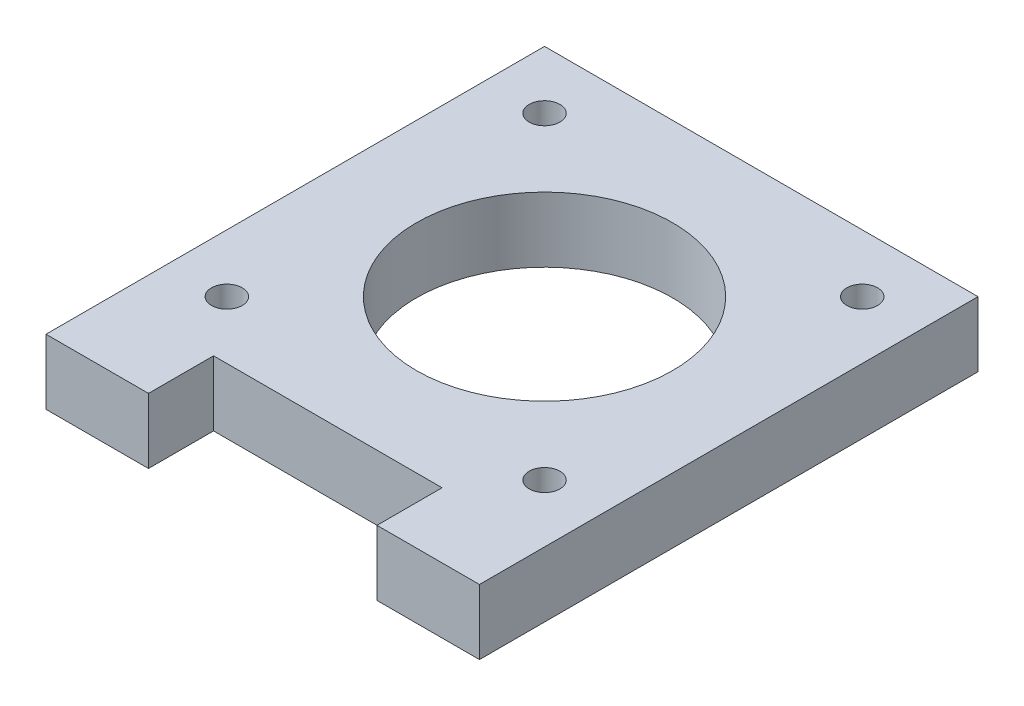
ISO-10303-21;
HEADER;
FILE_DESCRIPTION(('STEP AP214'),'2;1');
FILE_NAME('part.step','',(''),(''),'','','');
FILE_SCHEMA(('AUTOMOTIVE_DESIGN { 1 0 10303 214 1 1 1 1 }'));
ENDSEC;
DATA;
#1=APPLICATION_CONTEXT('core data for automotive mechanical design processes');
#2=APPLICATION_PROTOCOL_DEFINITION('international standard','automotive_design',2000,#1);
#3=PRODUCT_CONTEXT('',#1,'mechanical');
#4=PRODUCT('Part','Part','',(#3));
#5=PRODUCT_RELATED_PRODUCT_CATEGORY('part','',(#4));
#6=PRODUCT_DEFINITION_FORMATION('','',#4);
#7=PRODUCT_DEFINITION_CONTEXT('part definition',#1,'design');
#8=PRODUCT_DEFINITION('design','',#6,#7);
#9=PRODUCT_DEFINITION_SHAPE('','',#8);
#10=(LENGTH_UNIT() NAMED_UNIT(*) SI_UNIT(.MILLI.,.METRE.));
#11=(NAMED_UNIT(*) PLANE_ANGLE_UNIT() SI_UNIT($,.RADIAN.));
#12=(NAMED_UNIT(*) SI_UNIT($,.STERADIAN.) SOLID_ANGLE_UNIT());
#13=UNCERTAINTY_MEASURE_WITH_UNIT(LENGTH_MEASURE(1.E-05),#10,'distance_accuracy_value','');
#14=(GEOMETRIC_REPRESENTATION_CONTEXT(3) GLOBAL_UNCERTAINTY_ASSIGNED_CONTEXT((#13)) GLOBAL_UNIT_ASSIGNED_CONTEXT((#10,
#11,#12)) REPRESENTATION_CONTEXT('',''));
#15=CARTESIAN_POINT('',(0.,0.,0.));
#16=DIRECTION('',(0.,0.,1.));
#17=DIRECTION('',(1.,0.,0.));
#18=AXIS2_PLACEMENT_3D('',#15,#16,#17);
#19=CARTESIAN_POINT('',(0.,3.175,0.));
#20=DIRECTION('',(0.,-1.,0.));
#21=DIRECTION('',(0.,0.,-1.));
#22=AXIS2_PLACEMENT_3D('',#19,#20,#21);
#23=PLANE('',#22);
#24=DIRECTION('',(0.,0.,-1.));
#25=VECTOR('',#24,1.);
#26=CARTESIAN_POINT('',(21.15,3.175,21.15));
#27=LINE('',#26,#25);
#28=CARTESIAN_POINT('',(21.15,3.175,27.5));
#29=VERTEX_POINT('',#28);
#30=CARTESIAN_POINT('',(21.15,3.175,-21.15));
#31=VERTEX_POINT('',#30);
#32=EDGE_CURVE('E57',#29,#31,#27,.T.);
#33=ORIENTED_EDGE('',*,*,#32,.T.);
#34=DIRECTION('',(-1.,0.,0.));
#35=VECTOR('',#34,1.);
#36=CARTESIAN_POINT('',(-21.15,3.175,-21.15));
#37=LINE('',#36,#35);
#38=CARTESIAN_POINT('',(-21.15,3.175,-21.15));
#39=VERTEX_POINT('',#38);
#40=EDGE_CURVE('E101',#31,#39,#37,.T.);
#41=ORIENTED_EDGE('',*,*,#40,.T.);
#42=DIRECTION('',(0.,0.,1.));
#43=VECTOR('',#42,1.);
#44=CARTESIAN_POINT('',(-21.15,3.175,21.15));
#45=LINE('',#44,#43);
#46=CARTESIAN_POINT('',(-21.15,3.175,27.5));
#47=VERTEX_POINT('',#46);
#48=EDGE_CURVE('E187',#39,#47,#45,.T.);
#49=ORIENTED_EDGE('',*,*,#48,.T.);
#50=DIRECTION('',(1.,0.,0.));
#51=VECTOR('',#50,1.);
#52=CARTESIAN_POINT('',(-21.15,3.175,27.5));
#53=LINE('',#52,#51);
#54=CARTESIAN_POINT('',(-11.15,3.175,27.5));
#55=VERTEX_POINT('',#54);
#56=EDGE_CURVE('E202',#47,#55,#53,.T.);
#57=ORIENTED_EDGE('',*,*,#56,.T.);
#58=DIRECTION('',(0.,0.,-1.));
#59=VECTOR('',#58,1.);
#60=CARTESIAN_POINT('',(-11.15,3.175,27.5));
#61=LINE('',#60,#59);
#62=CARTESIAN_POINT('',(-11.15,3.175,21.15));
#63=VERTEX_POINT('',#62);
#64=EDGE_CURVE('E121',#55,#63,#61,.T.);
#65=ORIENTED_EDGE('',*,*,#64,.T.);
#66=DIRECTION('',(1.,0.,0.));
#67=VECTOR('',#66,1.);
#68=CARTESIAN_POINT('',(-11.15,3.175,21.15));
#69=LINE('',#68,#67);
#70=CARTESIAN_POINT('',(11.15,3.175,21.15));
#71=VERTEX_POINT('',#70);
#72=EDGE_CURVE('E115',#63,#71,#69,.T.);
#73=ORIENTED_EDGE('',*,*,#72,.T.);
#74=DIRECTION('',(0.,0.,1.));
#75=VECTOR('',#74,1.);
#76=CARTESIAN_POINT('',(11.15,3.175,21.15));
#77=LINE('',#76,#75);
#78=CARTESIAN_POINT('',(11.15,3.175,27.5));
#79=VERTEX_POINT('',#78);
#80=EDGE_CURVE('E119',#71,#79,#77,.T.);
#81=ORIENTED_EDGE('',*,*,#80,.T.);
#82=DIRECTION('',(1.,0.,0.));
#83=VECTOR('',#82,1.);
#84=CARTESIAN_POINT('',(11.15,3.175,27.5));
#85=LINE('',#84,#83);
#86=EDGE_CURVE('E138',#79,#29,#85,.T.);
#87=ORIENTED_EDGE('',*,*,#86,.T.);
#88=EDGE_LOOP('',(#33,#41,#49,#57,#65,#73,#81,#87));
#89=FACE_BOUND('',#88,.T.);
#90=CARTESIAN_POINT('',(0.,3.175,0.));
#91=DIRECTION('',(0.,1.,0.));
#92=DIRECTION('',(0.,0.,1.));
#93=AXIS2_PLACEMENT_3D('',#90,#91,#92);
#94=CIRCLE('',#93,12.5);
#95=CARTESIAN_POINT('',(0.,3.175,12.5));
#96=VERTEX_POINT('',#95);
#97=EDGE_CURVE('E150',#96,#96,#94,.T.);
#98=ORIENTED_EDGE('',*,*,#97,.F.);
#99=EDGE_LOOP('',(#98));
#100=FACE_BOUND('',#99,.T.);
#101=CARTESIAN_POINT('',(-15.5,3.175,-15.5));
#102=DIRECTION('',(0.,1.,0.));
#103=DIRECTION('',(0.,0.,1.));
#104=AXIS2_PLACEMENT_3D('',#101,#102,#103);
#105=CIRCLE('',#104,1.5);
#106=CARTESIAN_POINT('',(-15.5,3.175,-14.));
#107=VERTEX_POINT('',#106);
#108=EDGE_CURVE('E216',#107,#107,#105,.T.);
#109=ORIENTED_EDGE('',*,*,#108,.F.);
#110=EDGE_LOOP('',(#109));
#111=FACE_BOUND('',#110,.T.);
#112=CARTESIAN_POINT('',(15.5,3.175,-15.5));
#113=DIRECTION('',(0.,1.,0.));
#114=DIRECTION('',(0.,0.,1.));
#115=AXIS2_PLACEMENT_3D('',#112,#113,#114);
#116=CIRCLE('',#115,1.5);
#117=CARTESIAN_POINT('',(15.5,3.175,-14.));
#118=VERTEX_POINT('',#117);
#119=EDGE_CURVE('E224',#118,#118,#116,.T.);
#120=ORIENTED_EDGE('',*,*,#119,.F.);
#121=EDGE_LOOP('',(#120));
#122=FACE_BOUND('',#121,.T.);
#123=CARTESIAN_POINT('',(15.5,3.175,15.5));
#124=DIRECTION('',(0.,1.,0.));
#125=DIRECTION('',(0.,0.,1.));
#126=AXIS2_PLACEMENT_3D('',#123,#124,#125);
#127=CIRCLE('',#126,1.5);
#128=CARTESIAN_POINT('',(15.5,3.175,17.));
#129=VERTEX_POINT('',#128);
#130=EDGE_CURVE('E232',#129,#129,#127,.T.);
#131=ORIENTED_EDGE('',*,*,#130,.F.);
#132=EDGE_LOOP('',(#131));
#133=FACE_BOUND('',#132,.T.);
#134=CARTESIAN_POINT('',(-15.5,3.175,15.5));
#135=DIRECTION('',(0.,1.,0.));
#136=DIRECTION('',(0.,0.,1.));
#137=AXIS2_PLACEMENT_3D('',#134,#135,#136);
#138=CIRCLE('',#137,1.5);
#139=CARTESIAN_POINT('',(-15.5,3.175,17.));
#140=VERTEX_POINT('',#139);
#141=EDGE_CURVE('E240',#140,#140,#138,.T.);
#142=ORIENTED_EDGE('',*,*,#141,.F.);
#143=EDGE_LOOP('',(#142));
#144=FACE_BOUND('',#143,.T.);
#145=ADVANCED_FACE('F39',(#89,#100,#111,#122,#133,#144),#23,.F.);
#146=CARTESIAN_POINT('',(0.,-3.175,0.));
#147=DIRECTION('',(0.,-1.,0.));
#148=DIRECTION('',(0.,0.,-1.));
#149=AXIS2_PLACEMENT_3D('',#146,#147,#148);
#150=PLANE('',#149);
#151=CARTESIAN_POINT('',(15.5,-3.175,15.5));
#152=DIRECTION('',(0.,1.,0.));
#153=DIRECTION('',(0.,0.,1.));
#154=AXIS2_PLACEMENT_3D('',#151,#152,#153);
#155=CIRCLE('',#154,1.5);
#156=CARTESIAN_POINT('',(15.5,-3.175,17.));
#157=VERTEX_POINT('',#156);
#158=EDGE_CURVE('E236',#157,#157,#155,.T.);
#159=ORIENTED_EDGE('',*,*,#158,.T.);
#160=EDGE_LOOP('',(#159));
#161=FACE_BOUND('',#160,.T.);
#162=CARTESIAN_POINT('',(-15.5,-3.175,-15.5));
#163=DIRECTION('',(0.,1.,0.));
#164=DIRECTION('',(0.,0.,1.));
#165=AXIS2_PLACEMENT_3D('',#162,#163,#164);
#166=CIRCLE('',#165,1.5);
#167=CARTESIAN_POINT('',(-15.5,-3.175,-14.));
#168=VERTEX_POINT('',#167);
#169=EDGE_CURVE('E220',#168,#168,#166,.T.);
#170=ORIENTED_EDGE('',*,*,#169,.T.);
#171=EDGE_LOOP('',(#170));
#172=FACE_BOUND('',#171,.T.);
#173=DIRECTION('',(-1.,0.,0.));
#174=VECTOR('',#173,1.);
#175=CARTESIAN_POINT('',(-21.15,-3.175,-21.15));
#176=LINE('',#175,#174);
#177=CARTESIAN_POINT('',(21.15,-3.175,-21.15));
#178=VERTEX_POINT('',#177);
#179=CARTESIAN_POINT('',(-21.15,-3.175,-21.15));
#180=VERTEX_POINT('',#179);
#181=EDGE_CURVE('E145',#178,#180,#176,.T.);
#182=ORIENTED_EDGE('',*,*,#181,.F.);
#183=DIRECTION('',(0.,0.,-1.));
#184=VECTOR('',#183,1.);
#185=CARTESIAN_POINT('',(21.15,-3.175,27.5));
#186=LINE('',#185,#184);
#187=CARTESIAN_POINT('',(21.15,-3.175,27.5));
#188=VERTEX_POINT('',#187);
#189=EDGE_CURVE('E165',#188,#178,#186,.T.);
#190=ORIENTED_EDGE('',*,*,#189,.F.);
#191=DIRECTION('',(1.,0.,0.));
#192=VECTOR('',#191,1.);
#193=CARTESIAN_POINT('',(11.15,-3.175,27.5));
#194=LINE('',#193,#192);
#195=CARTESIAN_POINT('',(11.15,-3.175,27.5));
#196=VERTEX_POINT('',#195);
#197=EDGE_CURVE('E94',#196,#188,#194,.T.);
#198=ORIENTED_EDGE('',*,*,#197,.F.);
#199=DIRECTION('',(0.,0.,1.));
#200=VECTOR('',#199,1.);
#201=CARTESIAN_POINT('',(11.15,-3.175,21.15));
#202=LINE('',#201,#200);
#203=CARTESIAN_POINT('',(11.15,-3.175,21.15));
#204=VERTEX_POINT('',#203);
#205=EDGE_CURVE('E87',#204,#196,#202,.T.);
#206=ORIENTED_EDGE('',*,*,#205,.F.);
#207=DIRECTION('',(1.,0.,0.));
#208=VECTOR('',#207,1.);
#209=CARTESIAN_POINT('',(-11.15,-3.175,21.15));
#210=LINE('',#209,#208);
#211=CARTESIAN_POINT('',(-11.15,-3.175,21.15));
#212=VERTEX_POINT('',#211);
#213=EDGE_CURVE('E130',#212,#204,#210,.T.);
#214=ORIENTED_EDGE('',*,*,#213,.F.);
#215=DIRECTION('',(0.,0.,-1.));
#216=VECTOR('',#215,1.);
#217=CARTESIAN_POINT('',(-11.15,-3.175,27.5));
#218=LINE('',#217,#216);
#219=CARTESIAN_POINT('',(-11.15,-3.175,27.5));
#220=VERTEX_POINT('',#219);
#221=EDGE_CURVE('E156',#220,#212,#218,.T.);
#222=ORIENTED_EDGE('',*,*,#221,.F.);
#223=DIRECTION('',(1.,0.,0.));
#224=VECTOR('',#223,1.);
#225=CARTESIAN_POINT('',(-21.15,-3.175,27.5));
#226=LINE('',#225,#224);
#227=CARTESIAN_POINT('',(-21.15,-3.175,27.5));
#228=VERTEX_POINT('',#227);
#229=EDGE_CURVE('E153',#228,#220,#226,.T.);
#230=ORIENTED_EDGE('',*,*,#229,.F.);
#231=DIRECTION('',(0.,0.,1.));
#232=VECTOR('',#231,1.);
#233=CARTESIAN_POINT('',(-21.15,-3.175,21.15));
#234=LINE('',#233,#232);
#235=EDGE_CURVE('E149',#180,#228,#234,.T.);
#236=ORIENTED_EDGE('',*,*,#235,.F.);
#237=EDGE_LOOP('',(#182,#190,#198,#206,#214,#222,#230,#236));
#238=FACE_BOUND('',#237,.T.);
#239=CARTESIAN_POINT('',(0.,-3.175,0.));
#240=DIRECTION('',(0.,1.,0.));
#241=DIRECTION('',(0.,0.,1.));
#242=AXIS2_PLACEMENT_3D('',#239,#240,#241);
#243=CIRCLE('',#242,12.5);
#244=CARTESIAN_POINT('',(0.,-3.175,12.5));
#245=VERTEX_POINT('',#244);
#246=EDGE_CURVE('E212',#245,#245,#243,.T.);
#247=ORIENTED_EDGE('',*,*,#246,.T.);
#248=EDGE_LOOP('',(#247));
#249=FACE_BOUND('',#248,.T.);
#250=CARTESIAN_POINT('',(15.5,-3.175,-15.5));
#251=DIRECTION('',(0.,1.,0.));
#252=DIRECTION('',(0.,0.,1.));
#253=AXIS2_PLACEMENT_3D('',#250,#251,#252);
#254=CIRCLE('',#253,1.5);
#255=CARTESIAN_POINT('',(15.5,-3.175,-14.));
#256=VERTEX_POINT('',#255);
#257=EDGE_CURVE('E228',#256,#256,#254,.T.);
#258=ORIENTED_EDGE('',*,*,#257,.T.);
#259=EDGE_LOOP('',(#258));
#260=FACE_BOUND('',#259,.T.);
#261=CARTESIAN_POINT('',(-15.5,-3.175,15.5));
#262=DIRECTION('',(0.,1.,0.));
#263=DIRECTION('',(0.,0.,1.));
#264=AXIS2_PLACEMENT_3D('',#261,#262,#263);
#265=CIRCLE('',#264,1.5);
#266=CARTESIAN_POINT('',(-15.5,-3.175,17.));
#267=VERTEX_POINT('',#266);
#268=EDGE_CURVE('E244',#267,#267,#265,.T.);
#269=ORIENTED_EDGE('',*,*,#268,.T.);
#270=EDGE_LOOP('',(#269));
#271=FACE_BOUND('',#270,.T.);
#272=ADVANCED_FACE('F191',(#161,#172,#238,#249,#260,#271),#150,.T.);
#273=CARTESIAN_POINT('',(-21.15,3.175,-21.15));
#274=DIRECTION('',(0.,0.,1.));
#275=DIRECTION('',(1.,0.,0.));
#276=AXIS2_PLACEMENT_3D('',#273,#274,#275);
#277=PLANE('',#276);
#278=ORIENTED_EDGE('',*,*,#181,.T.);
#279=DIRECTION('',(0.,-1.,0.));
#280=VECTOR('',#279,1.);
#281=CARTESIAN_POINT('',(-21.15,3.175,-21.15));
#282=LINE('',#281,#280);
#283=EDGE_CURVE('E49',#39,#180,#282,.T.);
#284=ORIENTED_EDGE('',*,*,#283,.F.);
#285=ORIENTED_EDGE('',*,*,#40,.F.);
#286=DIRECTION('',(0.,-1.,0.));
#287=VECTOR('',#286,1.);
#288=CARTESIAN_POINT('',(21.15,3.175,-21.15));
#289=LINE('',#288,#287);
#290=EDGE_CURVE('E11',#31,#178,#289,.T.);
#291=ORIENTED_EDGE('',*,*,#290,.T.);
#292=EDGE_LOOP('',(#278,#284,#285,#291));
#293=FACE_BOUND('',#292,.T.);
#294=ADVANCED_FACE('F41',(#293),#277,.F.);
#295=CARTESIAN_POINT('',(-21.15,3.175,21.15));
#296=DIRECTION('',(1.,0.,0.));
#297=DIRECTION('',(0.,0.,-1.));
#298=AXIS2_PLACEMENT_3D('',#295,#296,#297);
#299=PLANE('',#298);
#300=ORIENTED_EDGE('',*,*,#235,.T.);
#301=DIRECTION('',(0.,-1.,0.));
#302=VECTOR('',#301,1.);
#303=CARTESIAN_POINT('',(-21.15,3.175,27.5));
#304=LINE('',#303,#302);
#305=EDGE_CURVE('E178',#47,#228,#304,.T.);
#306=ORIENTED_EDGE('',*,*,#305,.F.);
#307=ORIENTED_EDGE('',*,*,#48,.F.);
#308=ORIENTED_EDGE('',*,*,#283,.T.);
#309=EDGE_LOOP('',(#300,#306,#307,#308));
#310=FACE_BOUND('',#309,.T.);
#311=ADVANCED_FACE('F185',(#310),#299,.F.);
#312=CARTESIAN_POINT('',(-21.15,3.175,27.5));
#313=DIRECTION('',(0.,0.,-1.));
#314=DIRECTION('',(-1.,0.,0.));
#315=AXIS2_PLACEMENT_3D('',#312,#313,#314);
#316=PLANE('',#315);
#317=ORIENTED_EDGE('',*,*,#229,.T.);
#318=DIRECTION('',(0.,-1.,0.));
#319=VECTOR('',#318,1.);
#320=CARTESIAN_POINT('',(-11.15,3.175,27.5));
#321=LINE('',#320,#319);
#322=EDGE_CURVE('E174',#55,#220,#321,.T.);
#323=ORIENTED_EDGE('',*,*,#322,.F.);
#324=ORIENTED_EDGE('',*,*,#56,.F.);
#325=ORIENTED_EDGE('',*,*,#305,.T.);
#326=EDGE_LOOP('',(#317,#323,#324,#325));
#327=FACE_BOUND('',#326,.T.);
#328=ADVANCED_FACE('F197',(#327),#316,.F.);
#329=CARTESIAN_POINT('',(-11.15,3.175,27.5));
#330=DIRECTION('',(-1.,0.,0.));
#331=DIRECTION('',(0.,0.,1.));
#332=AXIS2_PLACEMENT_3D('',#329,#330,#331);
#333=PLANE('',#332);
#334=ORIENTED_EDGE('',*,*,#221,.T.);
#335=DIRECTION('',(0.,-1.,0.));
#336=VECTOR('',#335,1.);
#337=CARTESIAN_POINT('',(-11.15,3.175,21.15));
#338=LINE('',#337,#336);
#339=EDGE_CURVE('E132',#63,#212,#338,.T.);
#340=ORIENTED_EDGE('',*,*,#339,.F.);
#341=ORIENTED_EDGE('',*,*,#64,.F.);
#342=ORIENTED_EDGE('',*,*,#322,.T.);
#343=EDGE_LOOP('',(#334,#340,#341,#342));
#344=FACE_BOUND('',#343,.T.);
#345=ADVANCED_FACE('F200',(#344),#333,.F.);
#346=CARTESIAN_POINT('',(-11.15,3.175,21.15));
#347=DIRECTION('',(0.,0.,-1.));
#348=DIRECTION('',(-1.,0.,0.));
#349=AXIS2_PLACEMENT_3D('',#346,#347,#348);
#350=PLANE('',#349);
#351=ORIENTED_EDGE('',*,*,#213,.T.);
#352=DIRECTION('',(0.,-1.,0.));
#353=VECTOR('',#352,1.);
#354=CARTESIAN_POINT('',(11.15,3.175,21.15));
#355=LINE('',#354,#353);
#356=EDGE_CURVE('E127',#71,#204,#355,.T.);
#357=ORIENTED_EDGE('',*,*,#356,.F.);
#358=ORIENTED_EDGE('',*,*,#72,.F.);
#359=ORIENTED_EDGE('',*,*,#339,.T.);
#360=EDGE_LOOP('',(#351,#357,#358,#359));
#361=FACE_BOUND('',#360,.T.);
#362=ADVANCED_FACE('F128',(#361),#350,.F.);
#363=CARTESIAN_POINT('',(11.15,3.175,21.15));
#364=DIRECTION('',(1.,0.,0.));
#365=DIRECTION('',(0.,0.,-1.));
#366=AXIS2_PLACEMENT_3D('',#363,#364,#365);
#367=PLANE('',#366);
#368=ORIENTED_EDGE('',*,*,#205,.T.);
#369=DIRECTION('',(0.,-1.,0.));
#370=VECTOR('',#369,1.);
#371=CARTESIAN_POINT('',(11.15,3.175,27.5));
#372=LINE('',#371,#370);
#373=EDGE_CURVE('E133',#79,#196,#372,.T.);
#374=ORIENTED_EDGE('',*,*,#373,.F.);
#375=ORIENTED_EDGE('',*,*,#80,.F.);
#376=ORIENTED_EDGE('',*,*,#356,.T.);
#377=EDGE_LOOP('',(#368,#374,#375,#376));
#378=FACE_BOUND('',#377,.T.);
#379=ADVANCED_FACE('F135',(#378),#367,.F.);
#380=CARTESIAN_POINT('',(11.15,3.175,27.5));
#381=DIRECTION('',(0.,0.,-1.));
#382=DIRECTION('',(-1.,0.,0.));
#383=AXIS2_PLACEMENT_3D('',#380,#381,#382);
#384=PLANE('',#383);
#385=ORIENTED_EDGE('',*,*,#197,.T.);
#386=DIRECTION('',(0.,-1.,0.));
#387=VECTOR('',#386,1.);
#388=CARTESIAN_POINT('',(21.15,3.175,27.5));
#389=LINE('',#388,#387);
#390=EDGE_CURVE('E141',#29,#188,#389,.T.);
#391=ORIENTED_EDGE('',*,*,#390,.F.);
#392=ORIENTED_EDGE('',*,*,#86,.F.);
#393=ORIENTED_EDGE('',*,*,#373,.T.);
#394=EDGE_LOOP('',(#385,#391,#392,#393));
#395=FACE_BOUND('',#394,.T.);
#396=ADVANCED_FACE('F269',(#395),#384,.F.);
#397=CARTESIAN_POINT('',(21.15,3.175,27.5));
#398=DIRECTION('',(-1.,0.,0.));
#399=DIRECTION('',(0.,0.,1.));
#400=AXIS2_PLACEMENT_3D('',#397,#398,#399);
#401=PLANE('',#400);
#402=ORIENTED_EDGE('',*,*,#189,.T.);
#403=ORIENTED_EDGE('',*,*,#290,.F.);
#404=ORIENTED_EDGE('',*,*,#32,.F.);
#405=ORIENTED_EDGE('',*,*,#390,.T.);
#406=EDGE_LOOP('',(#402,#403,#404,#405));
#407=FACE_BOUND('',#406,.T.);
#408=ADVANCED_FACE('F266',(#407),#401,.F.);
#409=CARTESIAN_POINT('',(0.,3.175,0.));
#410=DIRECTION('',(0.,-1.,0.));
#411=DIRECTION('',(0.,0.,-1.));
#412=AXIS2_PLACEMENT_3D('',#409,#410,#411);
#413=CYLINDRICAL_SURFACE('',#412,12.5);
#414=ORIENTED_EDGE('',*,*,#97,.T.);
#415=EDGE_LOOP('',(#414));
#416=FACE_BOUND('',#415,.T.);
#417=ORIENTED_EDGE('',*,*,#246,.F.);
#418=EDGE_LOOP('',(#417));
#419=FACE_BOUND('',#418,.T.);
#420=ADVANCED_FACE('F263',(#416,#419),#413,.F.);
#421=CARTESIAN_POINT('',(-15.5,3.175,-15.5));
#422=DIRECTION('',(0.,-1.,0.));
#423=DIRECTION('',(0.,0.,-1.));
#424=AXIS2_PLACEMENT_3D('',#421,#422,#423);
#425=CYLINDRICAL_SURFACE('',#424,1.5);
#426=ORIENTED_EDGE('',*,*,#108,.T.);
#427=EDGE_LOOP('',(#426));
#428=FACE_BOUND('',#427,.T.);
#429=ORIENTED_EDGE('',*,*,#169,.F.);
#430=EDGE_LOOP('',(#429));
#431=FACE_BOUND('',#430,.T.);
#432=ADVANCED_FACE('F345',(#428,#431),#425,.F.);
#433=CARTESIAN_POINT('',(15.5,3.175,-15.5));
#434=DIRECTION('',(0.,-1.,0.));
#435=DIRECTION('',(0.,0.,-1.));
#436=AXIS2_PLACEMENT_3D('',#433,#434,#435);
#437=CYLINDRICAL_SURFACE('',#436,1.5);
#438=ORIENTED_EDGE('',*,*,#119,.T.);
#439=EDGE_LOOP('',(#438));
#440=FACE_BOUND('',#439,.T.);
#441=ORIENTED_EDGE('',*,*,#257,.F.);
#442=EDGE_LOOP('',(#441));
#443=FACE_BOUND('',#442,.T.);
#444=ADVANCED_FACE('F353',(#440,#443),#437,.F.);
#445=CARTESIAN_POINT('',(15.5,3.175,15.5));
#446=DIRECTION('',(0.,-1.,0.));
#447=DIRECTION('',(0.,0.,-1.));
#448=AXIS2_PLACEMENT_3D('',#445,#446,#447);
#449=CYLINDRICAL_SURFACE('',#448,1.5);
#450=ORIENTED_EDGE('',*,*,#130,.T.);
#451=EDGE_LOOP('',(#450));
#452=FACE_BOUND('',#451,.T.);
#453=ORIENTED_EDGE('',*,*,#158,.F.);
#454=EDGE_LOOP('',(#453));
#455=FACE_BOUND('',#454,.T.);
#456=ADVANCED_FACE('F361',(#452,#455),#449,.F.);
#457=CARTESIAN_POINT('',(-15.5,3.175,15.5));
#458=DIRECTION('',(0.,-1.,0.));
#459=DIRECTION('',(0.,0.,-1.));
#460=AXIS2_PLACEMENT_3D('',#457,#458,#459);
#461=CYLINDRICAL_SURFACE('',#460,1.5);
#462=ORIENTED_EDGE('',*,*,#141,.T.);
#463=EDGE_LOOP('',(#462));
#464=FACE_BOUND('',#463,.T.);
#465=ORIENTED_EDGE('',*,*,#268,.F.);
#466=EDGE_LOOP('',(#465));
#467=FACE_BOUND('',#466,.T.);
#468=ADVANCED_FACE('F252',(#464,#467),#461,.F.);
#469=CLOSED_SHELL('',(#145,#272,#294,#311,#328,#345,#362,#379,#396,#408,#420,#432,#444,#456,#468));
#470=MANIFOLD_SOLID_BREP('B2',#469);
#471=ADVANCED_BREP_SHAPE_REPRESENTATION('',(#18,#470),#14);
#472=SHAPE_DEFINITION_REPRESENTATION(#9,#471);
ENDSEC;
END-ISO-10303-21;
